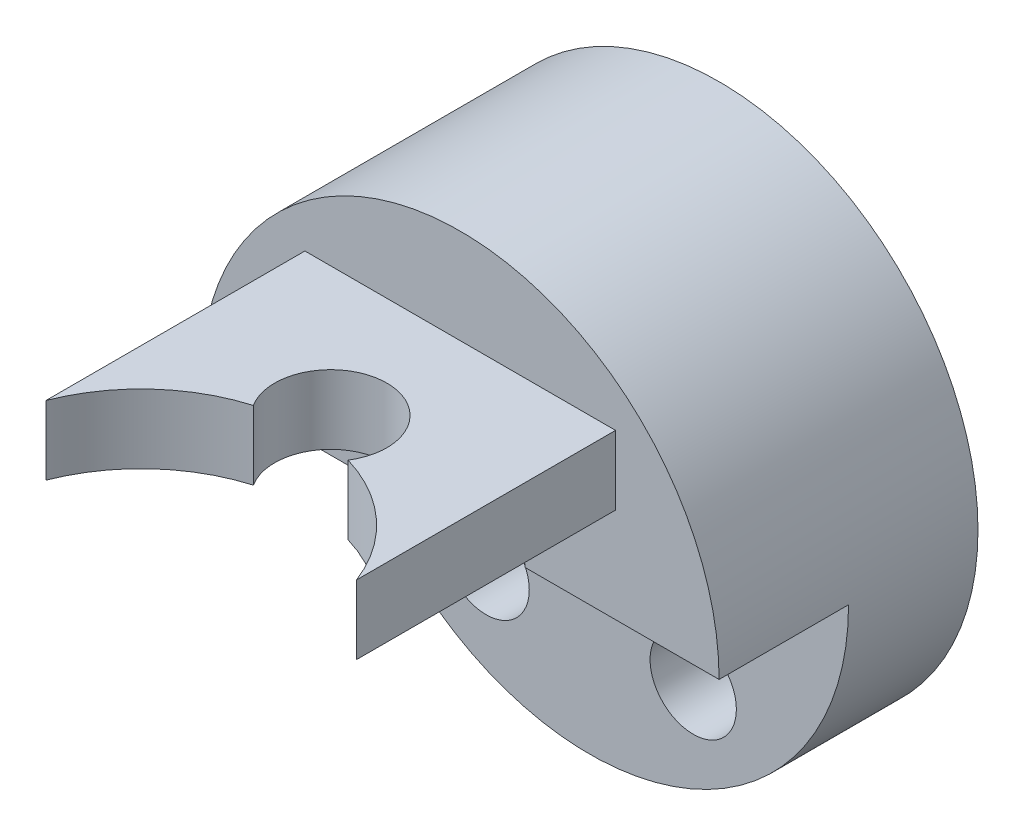
ISO-10303-21;
HEADER;
FILE_DESCRIPTION(('STEP AP214'),'2;1');
FILE_NAME('part.step','',(''),(''),'','','');
FILE_SCHEMA(('AUTOMOTIVE_DESIGN { 1 0 10303 214 1 1 1 1 }'));
ENDSEC;
DATA;
#1=APPLICATION_CONTEXT('core data for automotive mechanical design processes');
#2=APPLICATION_PROTOCOL_DEFINITION('international standard','automotive_design',2000,#1);
#3=PRODUCT_CONTEXT('',#1,'mechanical');
#4=PRODUCT('Part','Part','',(#3));
#5=PRODUCT_RELATED_PRODUCT_CATEGORY('part','',(#4));
#6=PRODUCT_DEFINITION_FORMATION('','',#4);
#7=PRODUCT_DEFINITION_CONTEXT('part definition',#1,'design');
#8=PRODUCT_DEFINITION('design','',#6,#7);
#9=PRODUCT_DEFINITION_SHAPE('','',#8);
#10=(LENGTH_UNIT() NAMED_UNIT(*) SI_UNIT(.MILLI.,.METRE.));
#11=(NAMED_UNIT(*) PLANE_ANGLE_UNIT() SI_UNIT($,.RADIAN.));
#12=(NAMED_UNIT(*) SI_UNIT($,.STERADIAN.) SOLID_ANGLE_UNIT());
#13=UNCERTAINTY_MEASURE_WITH_UNIT(LENGTH_MEASURE(1.E-05),#10,'distance_accuracy_value','');
#14=(GEOMETRIC_REPRESENTATION_CONTEXT(3) GLOBAL_UNCERTAINTY_ASSIGNED_CONTEXT((#13)) GLOBAL_UNIT_ASSIGNED_CONTEXT((#10,
#11,#12)) REPRESENTATION_CONTEXT('',''));
#15=CARTESIAN_POINT('',(0.,0.,0.));
#16=DIRECTION('',(0.,0.,1.));
#17=DIRECTION('',(1.,0.,0.));
#18=AXIS2_PLACEMENT_3D('',#15,#16,#17);
#19=CARTESIAN_POINT('',(0.,0.,30.));
#20=DIRECTION('',(0.,0.,1.));
#21=DIRECTION('',(1.,0.,0.));
#22=AXIS2_PLACEMENT_3D('',#19,#20,#21);
#23=PLANE('',#22);
#24=CARTESIAN_POINT('',(0.,0.,30.));
#25=DIRECTION('',(0.,0.,1.));
#26=DIRECTION('',(1.,0.,0.));
#27=AXIS2_PLACEMENT_3D('',#24,#25,#26);
#28=CIRCLE('',#27,7.5);
#29=CARTESIAN_POINT('',(7.5,0.,30.));
#30=VERTEX_POINT('',#29);
#31=CARTESIAN_POINT('',(-7.5,0.,30.));
#32=VERTEX_POINT('',#31);
#33=EDGE_CURVE('E155',#30,#32,#28,.T.);
#34=ORIENTED_EDGE('',*,*,#33,.F.);
#35=DIRECTION('',(1.,0.,0.));
#36=VECTOR('',#35,1.);
#37=CARTESIAN_POINT('',(-30.,0.,30.));
#38=LINE('',#37,#36);
#39=CARTESIAN_POINT('',(30.,0.,30.));
#40=VERTEX_POINT('',#39);
#41=EDGE_CURVE('E172',#30,#40,#38,.T.);
#42=ORIENTED_EDGE('',*,*,#41,.T.);
#43=CARTESIAN_POINT('',(0.,0.,30.));
#44=DIRECTION('',(0.,0.,1.));
#45=DIRECTION('',(1.,0.,0.));
#46=AXIS2_PLACEMENT_3D('',#43,#44,#45);
#47=CIRCLE('',#46,30.);
#48=CARTESIAN_POINT('',(-30.,0.,30.));
#49=VERTEX_POINT('',#48);
#50=EDGE_CURVE('E169',#40,#49,#47,.T.);
#51=ORIENTED_EDGE('',*,*,#50,.T.);
#52=EDGE_CURVE('E174',#49,#32,#38,.T.);
#53=ORIENTED_EDGE('',*,*,#52,.T.);
#54=EDGE_LOOP('',(#34,#42,#51,#53));
#55=FACE_BOUND('',#54,.T.);
#56=DIRECTION('',(-1.,0.,0.));
#57=VECTOR('',#56,1.);
#58=CARTESIAN_POINT('',(-18.,19.,30.));
#59=LINE('',#58,#57);
#60=CARTESIAN_POINT('',(18.,19.,30.));
#61=VERTEX_POINT('',#60);
#62=CARTESIAN_POINT('',(-18.,19.,30.));
#63=VERTEX_POINT('',#62);
#64=EDGE_CURVE('E141',#61,#63,#59,.T.);
#65=ORIENTED_EDGE('',*,*,#64,.F.);
#66=DIRECTION('',(0.,1.,0.));
#67=VECTOR('',#66,1.);
#68=CARTESIAN_POINT('',(18.,11.,30.));
#69=LINE('',#68,#67);
#70=CARTESIAN_POINT('',(18.,11.,30.));
#71=VERTEX_POINT('',#70);
#72=EDGE_CURVE('E129',#71,#61,#69,.T.);
#73=ORIENTED_EDGE('',*,*,#72,.F.);
#74=DIRECTION('',(1.,0.,0.));
#75=VECTOR('',#74,1.);
#76=CARTESIAN_POINT('',(-18.,11.,30.));
#77=LINE('',#76,#75);
#78=CARTESIAN_POINT('',(-18.,11.,30.));
#79=VERTEX_POINT('',#78);
#80=EDGE_CURVE('E137',#79,#71,#77,.T.);
#81=ORIENTED_EDGE('',*,*,#80,.F.);
#82=DIRECTION('',(0.,-1.,0.));
#83=VECTOR('',#82,1.);
#84=CARTESIAN_POINT('',(-18.,11.,30.));
#85=LINE('',#84,#83);
#86=EDGE_CURVE('E143',#63,#79,#85,.T.);
#87=ORIENTED_EDGE('',*,*,#86,.F.);
#88=EDGE_LOOP('',(#65,#73,#81,#87));
#89=FACE_BOUND('',#88,.T.);
#90=ADVANCED_FACE('F35',(#55,#89),#23,.T.);
#91=CARTESIAN_POINT('',(-30.,0.,30.));
#92=DIRECTION('',(0.,1.,0.));
#93=DIRECTION('',(0.,0.,1.));
#94=AXIS2_PLACEMENT_3D('',#91,#92,#93);
#95=PLANE('',#94);
#96=DIRECTION('',(1.,0.,0.));
#97=VECTOR('',#96,1.);
#98=CARTESIAN_POINT('',(-30.,0.,15.));
#99=LINE('',#98,#97);
#100=CARTESIAN_POINT('',(-30.,0.,15.));
#101=VERTEX_POINT('',#100);
#102=CARTESIAN_POINT('',(-7.5,0.,15.));
#103=VERTEX_POINT('',#102);
#104=EDGE_CURVE('E173',#101,#103,#99,.T.);
#105=ORIENTED_EDGE('',*,*,#104,.T.);
#106=DIRECTION('',(0.,0.,1.));
#107=VECTOR('',#106,1.);
#108=CARTESIAN_POINT('',(-7.5,0.,0.));
#109=LINE('',#108,#107);
#110=EDGE_CURVE('E165',#103,#32,#109,.T.);
#111=ORIENTED_EDGE('',*,*,#110,.T.);
#112=ORIENTED_EDGE('',*,*,#52,.F.);
#113=DIRECTION('',(0.,0.,-1.));
#114=VECTOR('',#113,1.);
#115=CARTESIAN_POINT('',(-30.,0.,30.));
#116=LINE('',#115,#114);
#117=EDGE_CURVE('E190',#49,#101,#116,.T.);
#118=ORIENTED_EDGE('',*,*,#117,.T.);
#119=EDGE_LOOP('',(#105,#111,#112,#118));
#120=FACE_BOUND('',#119,.T.);
#121=ADVANCED_FACE('F223',(#120),#95,.F.);
#122=CARTESIAN_POINT('',(0.,0.,15.));
#123=DIRECTION('',(0.,0.,-1.));
#124=DIRECTION('',(-1.,0.,0.));
#125=AXIS2_PLACEMENT_3D('',#122,#123,#124);
#126=CYLINDRICAL_SURFACE('',#125,30.);
#127=CARTESIAN_POINT('',(0.,0.,15.));
#128=DIRECTION('',(0.,0.,1.));
#129=DIRECTION('',(1.,0.,0.));
#130=AXIS2_PLACEMENT_3D('',#127,#128,#129);
#131=CIRCLE('',#130,30.);
#132=CARTESIAN_POINT('',(30.,0.,15.));
#133=VERTEX_POINT('',#132);
#134=EDGE_CURVE('E116',#101,#133,#131,.T.);
#135=ORIENTED_EDGE('',*,*,#134,.F.);
#136=ORIENTED_EDGE('',*,*,#117,.F.);
#137=ORIENTED_EDGE('',*,*,#50,.F.);
#138=DIRECTION('',(0.,0.,-1.));
#139=VECTOR('',#138,1.);
#140=CARTESIAN_POINT('',(30.,0.,30.));
#141=LINE('',#140,#139);
#142=EDGE_CURVE('E177',#40,#133,#141,.T.);
#143=ORIENTED_EDGE('',*,*,#142,.T.);
#144=EDGE_LOOP('',(#135,#136,#137,#143));
#145=FACE_BOUND('',#144,.T.);
#146=CARTESIAN_POINT('',(0.,0.,0.));
#147=DIRECTION('',(0.,0.,1.));
#148=DIRECTION('',(1.,0.,0.));
#149=AXIS2_PLACEMENT_3D('',#146,#147,#148);
#150=CIRCLE('',#149,30.);
#151=CARTESIAN_POINT('',(30.,0.,0.));
#152=VERTEX_POINT('',#151);
#153=EDGE_CURVE('E180',#152,#152,#150,.T.);
#154=ORIENTED_EDGE('',*,*,#153,.T.);
#155=EDGE_LOOP('',(#154));
#156=FACE_BOUND('',#155,.T.);
#157=ADVANCED_FACE('F37',(#145,#156),#126,.T.);
#158=CARTESIAN_POINT('',(0.,0.,15.));
#159=DIRECTION('',(0.,0.,1.));
#160=DIRECTION('',(1.,0.,0.));
#161=AXIS2_PLACEMENT_3D('',#158,#159,#160);
#162=PLANE('',#161);
#163=CARTESIAN_POINT('',(12.,-17.,15.));
#164=DIRECTION('',(0.,0.,1.));
#165=DIRECTION('',(1.,0.,0.));
#166=AXIS2_PLACEMENT_3D('',#163,#164,#165);
#167=CIRCLE('',#166,5.);
#168=CARTESIAN_POINT('',(17.,-17.,15.));
#169=VERTEX_POINT('',#168);
#170=EDGE_CURVE('E274',#169,#169,#167,.T.);
#171=ORIENTED_EDGE('',*,*,#170,.F.);
#172=EDGE_LOOP('',(#171));
#173=FACE_BOUND('',#172,.T.);
#174=CARTESIAN_POINT('',(-12.,-17.,15.));
#175=DIRECTION('',(0.,0.,1.));
#176=DIRECTION('',(1.,0.,0.));
#177=AXIS2_PLACEMENT_3D('',#174,#175,#176);
#178=CIRCLE('',#177,5.);
#179=CARTESIAN_POINT('',(-7.,-17.,15.));
#180=VERTEX_POINT('',#179);
#181=EDGE_CURVE('E276',#180,#180,#178,.T.);
#182=ORIENTED_EDGE('',*,*,#181,.F.);
#183=EDGE_LOOP('',(#182));
#184=FACE_BOUND('',#183,.T.);
#185=CARTESIAN_POINT('',(0.,0.,15.));
#186=DIRECTION('',(0.,0.,1.));
#187=DIRECTION('',(1.,0.,0.));
#188=AXIS2_PLACEMENT_3D('',#185,#186,#187);
#189=CIRCLE('',#188,7.5);
#190=CARTESIAN_POINT('',(7.5,0.,15.));
#191=VERTEX_POINT('',#190);
#192=EDGE_CURVE('E163',#103,#191,#189,.T.);
#193=ORIENTED_EDGE('',*,*,#192,.F.);
#194=ORIENTED_EDGE('',*,*,#104,.F.);
#195=ORIENTED_EDGE('',*,*,#134,.T.);
#196=EDGE_CURVE('E168',#191,#133,#99,.T.);
#197=ORIENTED_EDGE('',*,*,#196,.F.);
#198=EDGE_LOOP('',(#193,#194,#195,#197));
#199=FACE_BOUND('',#198,.T.);
#200=ADVANCED_FACE('F208',(#173,#184,#199),#162,.T.);
#201=CARTESIAN_POINT('',(0.,0.,0.));
#202=DIRECTION('',(0.,0.,1.));
#203=DIRECTION('',(1.,0.,0.));
#204=AXIS2_PLACEMENT_3D('',#201,#202,#203);
#205=PLANE('',#204);
#206=CARTESIAN_POINT('',(12.,-17.,0.));
#207=DIRECTION('',(0.,0.,1.));
#208=DIRECTION('',(1.,0.,0.));
#209=AXIS2_PLACEMENT_3D('',#206,#207,#208);
#210=CIRCLE('',#209,5.);
#211=CARTESIAN_POINT('',(17.,-17.,0.));
#212=VERTEX_POINT('',#211);
#213=EDGE_CURVE('E271',#212,#212,#210,.T.);
#214=ORIENTED_EDGE('',*,*,#213,.T.);
#215=EDGE_LOOP('',(#214));
#216=FACE_BOUND('',#215,.T.);
#217=CARTESIAN_POINT('',(-12.,-17.,0.));
#218=DIRECTION('',(0.,0.,1.));
#219=DIRECTION('',(1.,0.,0.));
#220=AXIS2_PLACEMENT_3D('',#217,#218,#219);
#221=CIRCLE('',#220,5.);
#222=CARTESIAN_POINT('',(-7.,-17.,0.));
#223=VERTEX_POINT('',#222);
#224=EDGE_CURVE('E279',#223,#223,#221,.T.);
#225=ORIENTED_EDGE('',*,*,#224,.T.);
#226=EDGE_LOOP('',(#225));
#227=FACE_BOUND('',#226,.T.);
#228=CARTESIAN_POINT('',(0.,0.,0.));
#229=DIRECTION('',(0.,0.,1.));
#230=DIRECTION('',(1.,0.,0.));
#231=AXIS2_PLACEMENT_3D('',#228,#229,#230);
#232=CIRCLE('',#231,7.5);
#233=CARTESIAN_POINT('',(7.5,0.,0.));
#234=VERTEX_POINT('',#233);
#235=EDGE_CURVE('E156',#234,#234,#232,.T.);
#236=ORIENTED_EDGE('',*,*,#235,.T.);
#237=EDGE_LOOP('',(#236));
#238=FACE_BOUND('',#237,.T.);
#239=ORIENTED_EDGE('',*,*,#153,.F.);
#240=EDGE_LOOP('',(#239));
#241=FACE_BOUND('',#240,.T.);
#242=ADVANCED_FACE('F214',(#216,#227,#238,#241),#205,.F.);
#243=ORIENTED_EDGE('',*,*,#41,.F.);
#244=DIRECTION('',(0.,0.,1.));
#245=VECTOR('',#244,1.);
#246=CARTESIAN_POINT('',(7.5,0.,0.));
#247=LINE('',#246,#245);
#248=EDGE_CURVE('E159',#30,#191,#247,.F.);
#249=ORIENTED_EDGE('',*,*,#248,.T.);
#250=ORIENTED_EDGE('',*,*,#196,.T.);
#251=ORIENTED_EDGE('',*,*,#142,.F.);
#252=EDGE_LOOP('',(#243,#249,#250,#251));
#253=FACE_BOUND('',#252,.T.);
#254=ADVANCED_FACE('F204',(#253),#95,.F.);
#255=CARTESIAN_POINT('',(0.,0.,0.));
#256=DIRECTION('',(0.,0.,1.));
#257=DIRECTION('',(1.,0.,0.));
#258=AXIS2_PLACEMENT_3D('',#255,#256,#257);
#259=CYLINDRICAL_SURFACE('',#258,7.5);
#260=ORIENTED_EDGE('',*,*,#235,.F.);
#261=EDGE_LOOP('',(#260));
#262=FACE_BOUND('',#261,.T.);
#263=ORIENTED_EDGE('',*,*,#192,.T.);
#264=ORIENTED_EDGE('',*,*,#248,.F.);
#265=ORIENTED_EDGE('',*,*,#33,.T.);
#266=ORIENTED_EDGE('',*,*,#110,.F.);
#267=EDGE_LOOP('',(#263,#264,#265,#266));
#268=FACE_BOUND('',#267,.T.);
#269=ADVANCED_FACE('F221',(#262,#268),#259,.F.);
#270=CARTESIAN_POINT('',(18.,11.,60.));
#271=DIRECTION('',(-1.,0.,0.));
#272=DIRECTION('',(0.,0.,1.));
#273=AXIS2_PLACEMENT_3D('',#270,#271,#272);
#274=PLANE('',#273);
#275=ORIENTED_EDGE('',*,*,#72,.T.);
#276=DIRECTION('',(0.,0.,-1.));
#277=VECTOR('',#276,1.);
#278=CARTESIAN_POINT('',(18.,19.,60.));
#279=LINE('',#278,#277);
#280=CARTESIAN_POINT('',(18.,19.,60.));
#281=VERTEX_POINT('',#280);
#282=EDGE_CURVE('E153',#281,#61,#279,.T.);
#283=ORIENTED_EDGE('',*,*,#282,.F.);
#284=DIRECTION('',(0.,1.,0.));
#285=VECTOR('',#284,1.);
#286=CARTESIAN_POINT('',(18.,11.,60.));
#287=LINE('',#286,#285);
#288=CARTESIAN_POINT('',(18.,11.,60.));
#289=VERTEX_POINT('',#288);
#290=EDGE_CURVE('E134',#289,#281,#287,.T.);
#291=ORIENTED_EDGE('',*,*,#290,.F.);
#292=DIRECTION('',(0.,0.,-1.));
#293=VECTOR('',#292,1.);
#294=CARTESIAN_POINT('',(18.,11.,60.));
#295=LINE('',#294,#293);
#296=EDGE_CURVE('E122',#289,#71,#295,.T.);
#297=ORIENTED_EDGE('',*,*,#296,.T.);
#298=EDGE_LOOP('',(#275,#283,#291,#297));
#299=FACE_BOUND('',#298,.T.);
#300=ADVANCED_FACE('F240',(#299),#274,.F.);
#301=CARTESIAN_POINT('',(-18.,19.,60.));
#302=DIRECTION('',(0.,-1.,0.));
#303=DIRECTION('',(0.,0.,-1.));
#304=AXIS2_PLACEMENT_3D('',#301,#302,#303);
#305=PLANE('',#304);
#306=CARTESIAN_POINT('',(0.,19.,45.));
#307=DIRECTION('',(0.,-1.,0.));
#308=DIRECTION('',(0.,0.,-1.));
#309=AXIS2_PLACEMENT_3D('',#306,#307,#308);
#310=CIRCLE('',#309,6.5);
#311=CARTESIAN_POINT('',(-5.48808050544974,19.,48.4829545454545));
#312=VERTEX_POINT('',#311);
#313=CARTESIAN_POINT('',(5.48808050544975,19.,48.4829545454545));
#314=VERTEX_POINT('',#313);
#315=EDGE_CURVE('E126',#312,#314,#310,.T.);
#316=ORIENTED_EDGE('',*,*,#315,.T.);
#317=CARTESIAN_POINT('',(0.,19.,67.));
#318=DIRECTION('',(0.,-1.,0.));
#319=DIRECTION('',(0.,0.,-1.));
#320=AXIS2_PLACEMENT_3D('',#317,#318,#319);
#321=CIRCLE('',#320,19.313207915828);
#322=EDGE_CURVE('E50',#314,#281,#321,.T.);
#323=ORIENTED_EDGE('',*,*,#322,.T.);
#324=ORIENTED_EDGE('',*,*,#282,.T.);
#325=ORIENTED_EDGE('',*,*,#64,.T.);
#326=DIRECTION('',(0.,0.,-1.));
#327=VECTOR('',#326,1.);
#328=CARTESIAN_POINT('',(-18.,19.,60.));
#329=LINE('',#328,#327);
#330=CARTESIAN_POINT('',(-18.,19.,60.));
#331=VERTEX_POINT('',#330);
#332=EDGE_CURVE('E150',#331,#63,#329,.T.);
#333=ORIENTED_EDGE('',*,*,#332,.F.);
#334=EDGE_CURVE('E127',#331,#312,#321,.T.);
#335=ORIENTED_EDGE('',*,*,#334,.T.);
#336=EDGE_LOOP('',(#316,#323,#324,#325,#333,#335));
#337=FACE_BOUND('',#336,.T.);
#338=ADVANCED_FACE('F244',(#337),#305,.F.);
#339=CARTESIAN_POINT('',(-18.,11.,60.));
#340=DIRECTION('',(1.,0.,0.));
#341=DIRECTION('',(0.,0.,-1.));
#342=AXIS2_PLACEMENT_3D('',#339,#340,#341);
#343=PLANE('',#342);
#344=ORIENTED_EDGE('',*,*,#86,.T.);
#345=DIRECTION('',(0.,0.,-1.));
#346=VECTOR('',#345,1.);
#347=CARTESIAN_POINT('',(-18.,11.,60.));
#348=LINE('',#347,#346);
#349=CARTESIAN_POINT('',(-18.,11.,60.));
#350=VERTEX_POINT('',#349);
#351=EDGE_CURVE('E148',#350,#79,#348,.T.);
#352=ORIENTED_EDGE('',*,*,#351,.F.);
#353=DIRECTION('',(0.,-1.,0.));
#354=VECTOR('',#353,1.);
#355=CARTESIAN_POINT('',(-18.,11.,60.));
#356=LINE('',#355,#354);
#357=EDGE_CURVE('E136',#331,#350,#356,.T.);
#358=ORIENTED_EDGE('',*,*,#357,.F.);
#359=ORIENTED_EDGE('',*,*,#332,.T.);
#360=EDGE_LOOP('',(#344,#352,#358,#359));
#361=FACE_BOUND('',#360,.T.);
#362=ADVANCED_FACE('F248',(#361),#343,.F.);
#363=CARTESIAN_POINT('',(-18.,11.,60.));
#364=DIRECTION('',(0.,1.,0.));
#365=DIRECTION('',(0.,0.,1.));
#366=AXIS2_PLACEMENT_3D('',#363,#364,#365);
#367=PLANE('',#366);
#368=ORIENTED_EDGE('',*,*,#296,.F.);
#369=CARTESIAN_POINT('',(0.,11.,67.));
#370=DIRECTION('',(0.,-1.,0.));
#371=DIRECTION('',(0.,0.,-1.));
#372=AXIS2_PLACEMENT_3D('',#369,#370,#371);
#373=CIRCLE('',#372,19.313207915828);
#374=CARTESIAN_POINT('',(5.48808050544975,11.,48.4829545454546));
#375=VERTEX_POINT('',#374);
#376=EDGE_CURVE('E110',#375,#289,#373,.T.);
#377=ORIENTED_EDGE('',*,*,#376,.F.);
#378=CARTESIAN_POINT('',(0.,11.,45.));
#379=DIRECTION('',(0.,-1.,0.));
#380=DIRECTION('',(0.,0.,-1.));
#381=AXIS2_PLACEMENT_3D('',#378,#379,#380);
#382=CIRCLE('',#381,6.5);
#383=CARTESIAN_POINT('',(-5.48808050544974,11.,48.4829545454545));
#384=VERTEX_POINT('',#383);
#385=EDGE_CURVE('E120',#384,#375,#382,.T.);
#386=ORIENTED_EDGE('',*,*,#385,.F.);
#387=EDGE_CURVE('E58',#350,#384,#373,.T.);
#388=ORIENTED_EDGE('',*,*,#387,.F.);
#389=ORIENTED_EDGE('',*,*,#351,.T.);
#390=ORIENTED_EDGE('',*,*,#80,.T.);
#391=EDGE_LOOP('',(#368,#377,#386,#388,#389,#390));
#392=FACE_BOUND('',#391,.T.);
#393=ADVANCED_FACE('F119',(#392),#367,.F.);
#394=CARTESIAN_POINT('',(0.,30.,45.));
#395=DIRECTION('',(0.,-1.,0.));
#396=DIRECTION('',(0.,0.,-1.));
#397=AXIS2_PLACEMENT_3D('',#394,#395,#396);
#398=CYLINDRICAL_SURFACE('',#397,6.5);
#399=ORIENTED_EDGE('',*,*,#315,.F.);
#400=DIRECTION('',(0.,-1.,0.));
#401=VECTOR('',#400,1.);
#402=CARTESIAN_POINT('',(-5.48808050544974,20.5,48.4829545454545));
#403=LINE('',#402,#401);
#404=EDGE_CURVE('E11',#312,#384,#403,.T.);
#405=ORIENTED_EDGE('',*,*,#404,.T.);
#406=ORIENTED_EDGE('',*,*,#385,.T.);
#407=DIRECTION('',(0.,-1.,0.));
#408=VECTOR('',#407,1.);
#409=CARTESIAN_POINT('',(5.48808050544975,20.5,48.4829545454545));
#410=LINE('',#409,#408);
#411=EDGE_CURVE('E43',#375,#314,#410,.F.);
#412=ORIENTED_EDGE('',*,*,#411,.T.);
#413=EDGE_LOOP('',(#399,#405,#406,#412));
#414=FACE_BOUND('',#413,.T.);
#415=ADVANCED_FACE('F125',(#414),#398,.F.);
#416=CARTESIAN_POINT('',(0.,30.,67.));
#417=DIRECTION('',(0.,-1.,0.));
#418=DIRECTION('',(0.,0.,-1.));
#419=AXIS2_PLACEMENT_3D('',#416,#417,#418);
#420=CYLINDRICAL_SURFACE('',#419,19.313207915828);
#421=ORIENTED_EDGE('',*,*,#322,.F.);
#422=ORIENTED_EDGE('',*,*,#411,.F.);
#423=ORIENTED_EDGE('',*,*,#376,.T.);
#424=ORIENTED_EDGE('',*,*,#290,.T.);
#425=EDGE_LOOP('',(#421,#422,#423,#424));
#426=FACE_BOUND('',#425,.T.);
#427=ADVANCED_FACE('F109',(#426),#420,.F.);
#428=ORIENTED_EDGE('',*,*,#387,.T.);
#429=ORIENTED_EDGE('',*,*,#404,.F.);
#430=ORIENTED_EDGE('',*,*,#334,.F.);
#431=ORIENTED_EDGE('',*,*,#357,.T.);
#432=EDGE_LOOP('',(#428,#429,#430,#431));
#433=FACE_BOUND('',#432,.T.);
#434=ADVANCED_FACE('F257',(#433),#420,.F.);
#435=CARTESIAN_POINT('',(-12.,-17.,0.));
#436=DIRECTION('',(0.,0.,1.));
#437=DIRECTION('',(1.,0.,0.));
#438=AXIS2_PLACEMENT_3D('',#435,#436,#437);
#439=CYLINDRICAL_SURFACE('',#438,5.);
#440=ORIENTED_EDGE('',*,*,#224,.F.);
#441=EDGE_LOOP('',(#440));
#442=FACE_BOUND('',#441,.T.);
#443=ORIENTED_EDGE('',*,*,#181,.T.);
#444=EDGE_LOOP('',(#443));
#445=FACE_BOUND('',#444,.T.);
#446=ADVANCED_FACE('F260',(#442,#445),#439,.F.);
#447=CARTESIAN_POINT('',(12.,-17.,0.));
#448=DIRECTION('',(0.,0.,1.));
#449=DIRECTION('',(1.,0.,0.));
#450=AXIS2_PLACEMENT_3D('',#447,#448,#449);
#451=CYLINDRICAL_SURFACE('',#450,5.);
#452=ORIENTED_EDGE('',*,*,#213,.F.);
#453=EDGE_LOOP('',(#452));
#454=FACE_BOUND('',#453,.T.);
#455=ORIENTED_EDGE('',*,*,#170,.T.);
#456=EDGE_LOOP('',(#455));
#457=FACE_BOUND('',#456,.T.);
#458=ADVANCED_FACE('F263',(#454,#457),#451,.F.);
#459=CLOSED_SHELL('',(#90,#121,#157,#200,#242,#254,#269,#300,#338,#362,#393,#415,#427,#434,#446,#458));
#460=MANIFOLD_SOLID_BREP('B2',#459);
#461=ADVANCED_BREP_SHAPE_REPRESENTATION('',(#18,#460),#14);
#462=SHAPE_DEFINITION_REPRESENTATION(#9,#461);
ENDSEC;
END-ISO-10303-21;
